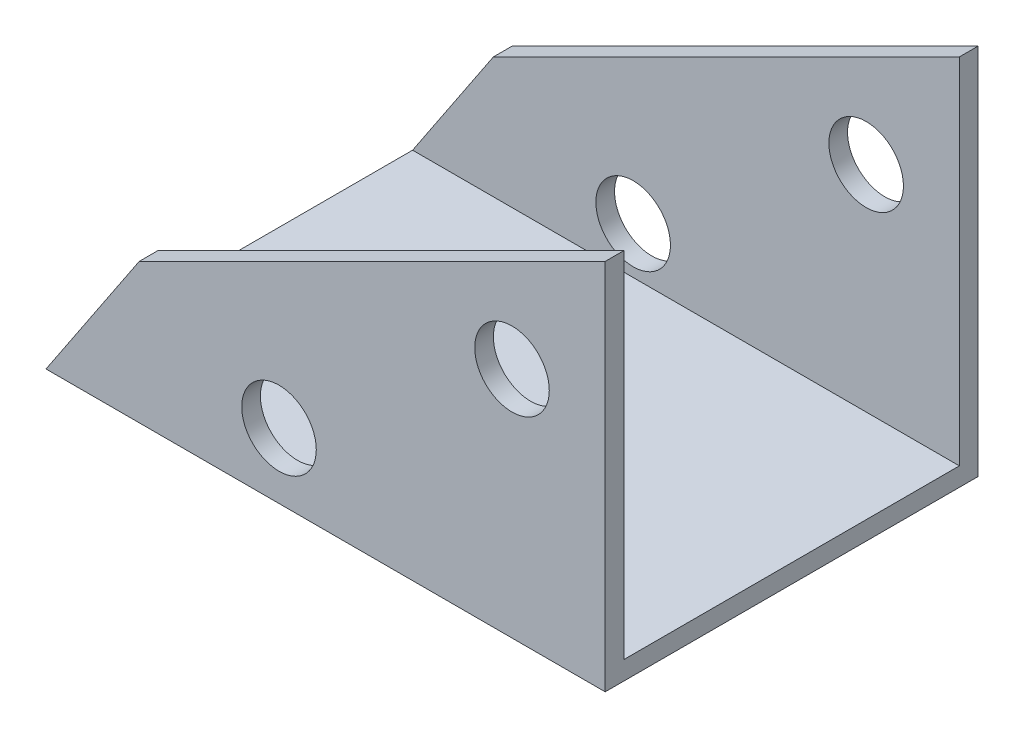
ISO-10303-21;
HEADER;
FILE_DESCRIPTION(('STEP AP214'),'2;1');
FILE_NAME('part.step','',(''),(''),'','','');
FILE_SCHEMA(('AUTOMOTIVE_DESIGN { 1 0 10303 214 1 1 1 1 }'));
ENDSEC;
DATA;
#1=APPLICATION_CONTEXT('core data for automotive mechanical design processes');
#2=APPLICATION_PROTOCOL_DEFINITION('international standard','automotive_design',2000,#1);
#3=PRODUCT_CONTEXT('',#1,'mechanical');
#4=PRODUCT('Part','Part','',(#3));
#5=PRODUCT_RELATED_PRODUCT_CATEGORY('part','',(#4));
#6=PRODUCT_DEFINITION_FORMATION('','',#4);
#7=PRODUCT_DEFINITION_CONTEXT('part definition',#1,'design');
#8=PRODUCT_DEFINITION('design','',#6,#7);
#9=PRODUCT_DEFINITION_SHAPE('','',#8);
#10=(LENGTH_UNIT() NAMED_UNIT(*) SI_UNIT(.MILLI.,.METRE.));
#11=(NAMED_UNIT(*) PLANE_ANGLE_UNIT() SI_UNIT($,.RADIAN.));
#12=(NAMED_UNIT(*) SI_UNIT($,.STERADIAN.) SOLID_ANGLE_UNIT());
#13=UNCERTAINTY_MEASURE_WITH_UNIT(LENGTH_MEASURE(1.E-05),#10,'distance_accuracy_value','');
#14=(GEOMETRIC_REPRESENTATION_CONTEXT(3) GLOBAL_UNCERTAINTY_ASSIGNED_CONTEXT((#13)) GLOBAL_UNIT_ASSIGNED_CONTEXT((#10,
#11,#12)) REPRESENTATION_CONTEXT('',''));
#15=CARTESIAN_POINT('',(0.,0.,0.));
#16=DIRECTION('',(0.,0.,1.));
#17=DIRECTION('',(1.,0.,0.));
#18=AXIS2_PLACEMENT_3D('',#15,#16,#17);
#19=CARTESIAN_POINT('',(0.,40.,0.));
#20=DIRECTION('',(0.,0.,-1.));
#21=DIRECTION('',(-1.,0.,0.));
#22=AXIS2_PLACEMENT_3D('',#19,#20,#21);
#23=PLANE('',#22);
#24=CARTESIAN_POINT('',(50.,25.,0.));
#25=DIRECTION('',(0.,0.,1.));
#26=DIRECTION('',(1.,0.,0.));
#27=AXIS2_PLACEMENT_3D('',#24,#25,#26);
#28=CIRCLE('',#27,4.00000000000001);
#29=CARTESIAN_POINT('',(54.,25.,0.));
#30=VERTEX_POINT('',#29);
#31=EDGE_CURVE('E265',#30,#30,#28,.T.);
#32=ORIENTED_EDGE('',*,*,#31,.F.);
#33=EDGE_LOOP('',(#32));
#34=FACE_BOUND('',#33,.T.);
#35=CARTESIAN_POINT('',(25.,7.,0.));
#36=DIRECTION('',(0.,0.,1.));
#37=DIRECTION('',(1.,0.,0.));
#38=AXIS2_PLACEMENT_3D('',#35,#36,#37);
#39=CIRCLE('',#38,4.);
#40=CARTESIAN_POINT('',(29.,7.,0.));
#41=VERTEX_POINT('',#40);
#42=EDGE_CURVE('E174',#41,#41,#39,.T.);
#43=ORIENTED_EDGE('',*,*,#42,.F.);
#44=EDGE_LOOP('',(#43));
#45=FACE_BOUND('',#44,.T.);
#46=DIRECTION('',(-0.554700196225229,-0.832050294337844,0.));
#47=VECTOR('',#46,1.);
#48=CARTESIAN_POINT('',(0.,0.,0.));
#49=LINE('',#48,#47);
#50=CARTESIAN_POINT('',(10.,15.,0.));
#51=VERTEX_POINT('',#50);
#52=CARTESIAN_POINT('',(0.,0.,0.));
#53=VERTEX_POINT('',#52);
#54=EDGE_CURVE('E166',#51,#53,#49,.T.);
#55=ORIENTED_EDGE('',*,*,#54,.T.);
#56=DIRECTION('',(1.,0.,0.));
#57=VECTOR('',#56,1.);
#58=CARTESIAN_POINT('',(0.,0.,0.));
#59=LINE('',#58,#57);
#60=CARTESIAN_POINT('',(60.,0.,0.));
#61=VERTEX_POINT('',#60);
#62=EDGE_CURVE('E217',#53,#61,#59,.T.);
#63=ORIENTED_EDGE('',*,*,#62,.T.);
#64=DIRECTION('',(0.,-1.,0.));
#65=VECTOR('',#64,1.);
#66=CARTESIAN_POINT('',(60.,40.,0.));
#67=LINE('',#66,#65);
#68=CARTESIAN_POINT('',(60.,40.,0.));
#69=VERTEX_POINT('',#68);
#70=EDGE_CURVE('E226',#69,#61,#67,.T.);
#71=ORIENTED_EDGE('',*,*,#70,.F.);
#72=DIRECTION('',(-0.894427190999916,-0.447213595499958,0.));
#73=VECTOR('',#72,1.);
#74=CARTESIAN_POINT('',(-4.,8.,0.));
#75=LINE('',#74,#73);
#76=EDGE_CURVE('E162',#69,#51,#75,.T.);
#77=ORIENTED_EDGE('',*,*,#76,.T.);
#78=EDGE_LOOP('',(#55,#63,#71,#77));
#79=FACE_BOUND('',#78,.T.);
#80=ADVANCED_FACE('F69',(#34,#45,#79),#23,.F.);
#81=CARTESIAN_POINT('',(0.,40.,-40.));
#82=DIRECTION('',(0.,0.,1.));
#83=DIRECTION('',(1.,0.,0.));
#84=AXIS2_PLACEMENT_3D('',#81,#82,#83);
#85=PLANE('',#84);
#86=CARTESIAN_POINT('',(50.,25.,-40.));
#87=DIRECTION('',(0.,0.,1.));
#88=DIRECTION('',(1.,0.,0.));
#89=AXIS2_PLACEMENT_3D('',#86,#87,#88);
#90=CIRCLE('',#89,4.00000000000001);
#91=CARTESIAN_POINT('',(54.,25.,-40.));
#92=VERTEX_POINT('',#91);
#93=EDGE_CURVE('E169',#92,#92,#90,.T.);
#94=ORIENTED_EDGE('',*,*,#93,.T.);
#95=EDGE_LOOP('',(#94));
#96=FACE_BOUND('',#95,.T.);
#97=CARTESIAN_POINT('',(25.,7.,-40.));
#98=DIRECTION('',(0.,0.,1.));
#99=DIRECTION('',(1.,0.,0.));
#100=AXIS2_PLACEMENT_3D('',#97,#98,#99);
#101=CIRCLE('',#100,4.);
#102=CARTESIAN_POINT('',(29.,7.,-40.));
#103=VERTEX_POINT('',#102);
#104=EDGE_CURVE('E318',#103,#103,#101,.T.);
#105=ORIENTED_EDGE('',*,*,#104,.T.);
#106=EDGE_LOOP('',(#105));
#107=FACE_BOUND('',#106,.T.);
#108=DIRECTION('',(-0.554700196225229,-0.832050294337844,0.));
#109=VECTOR('',#108,1.);
#110=CARTESIAN_POINT('',(0.,0.,-40.));
#111=LINE('',#110,#109);
#112=CARTESIAN_POINT('',(10.,15.,-40.));
#113=VERTEX_POINT('',#112);
#114=CARTESIAN_POINT('',(0.,0.,-40.));
#115=VERTEX_POINT('',#114);
#116=EDGE_CURVE('E149',#113,#115,#111,.T.);
#117=ORIENTED_EDGE('',*,*,#116,.F.);
#118=DIRECTION('',(-0.894427190999916,-0.447213595499958,0.));
#119=VECTOR('',#118,1.);
#120=CARTESIAN_POINT('',(-4.,8.,-40.));
#121=LINE('',#120,#119);
#122=CARTESIAN_POINT('',(60.,40.,-40.));
#123=VERTEX_POINT('',#122);
#124=EDGE_CURVE('E138',#123,#113,#121,.T.);
#125=ORIENTED_EDGE('',*,*,#124,.F.);
#126=DIRECTION('',(0.,-1.,0.));
#127=VECTOR('',#126,1.);
#128=CARTESIAN_POINT('',(60.,40.,-40.));
#129=LINE('',#128,#127);
#130=CARTESIAN_POINT('',(60.,0.,-40.));
#131=VERTEX_POINT('',#130);
#132=EDGE_CURVE('E214',#123,#131,#129,.T.);
#133=ORIENTED_EDGE('',*,*,#132,.T.);
#134=DIRECTION('',(-1.,0.,0.));
#135=VECTOR('',#134,1.);
#136=CARTESIAN_POINT('',(0.,0.,-40.));
#137=LINE('',#136,#135);
#138=EDGE_CURVE('E159',#131,#115,#137,.T.);
#139=ORIENTED_EDGE('',*,*,#138,.T.);
#140=EDGE_LOOP('',(#117,#125,#133,#139));
#141=FACE_BOUND('',#140,.T.);
#142=ADVANCED_FACE('F157',(#96,#107,#141),#85,.F.);
#143=CARTESIAN_POINT('',(0.,2.,-2.));
#144=DIRECTION('',(0.,0.,1.));
#145=DIRECTION('',(1.,0.,0.));
#146=AXIS2_PLACEMENT_3D('',#143,#144,#145);
#147=PLANE('',#146);
#148=CARTESIAN_POINT('',(50.,25.,-2.));
#149=DIRECTION('',(0.,0.,1.));
#150=DIRECTION('',(1.,0.,0.));
#151=AXIS2_PLACEMENT_3D('',#148,#149,#150);
#152=CIRCLE('',#151,4.00000000000001);
#153=CARTESIAN_POINT('',(54.,25.,-2.));
#154=VERTEX_POINT('',#153);
#155=EDGE_CURVE('E188',#154,#154,#152,.T.);
#156=ORIENTED_EDGE('',*,*,#155,.T.);
#157=EDGE_LOOP('',(#156));
#158=FACE_BOUND('',#157,.T.);
#159=CARTESIAN_POINT('',(25.,7.,-2.));
#160=DIRECTION('',(0.,0.,1.));
#161=DIRECTION('',(1.,0.,0.));
#162=AXIS2_PLACEMENT_3D('',#159,#160,#161);
#163=CIRCLE('',#162,4.);
#164=CARTESIAN_POINT('',(29.,7.,-2.));
#165=VERTEX_POINT('',#164);
#166=EDGE_CURVE('E184',#165,#165,#163,.T.);
#167=ORIENTED_EDGE('',*,*,#166,.T.);
#168=EDGE_LOOP('',(#167));
#169=FACE_BOUND('',#168,.T.);
#170=DIRECTION('',(-0.554700196225229,-0.832050294337844,0.));
#171=VECTOR('',#170,1.);
#172=CARTESIAN_POINT('',(0.923076923076924,1.38461538461539,-2.));
#173=LINE('',#172,#171);
#174=CARTESIAN_POINT('',(10.,15.,-2.));
#175=VERTEX_POINT('',#174);
#176=CARTESIAN_POINT('',(1.33333333333333,2.,-2.));
#177=VERTEX_POINT('',#176);
#178=EDGE_CURVE('E86',#175,#177,#173,.T.);
#179=ORIENTED_EDGE('',*,*,#178,.F.);
#180=DIRECTION('',(-0.894427190999916,-0.447213595499958,0.));
#181=VECTOR('',#180,1.);
#182=CARTESIAN_POINT('',(-3.2,8.4,-2.));
#183=LINE('',#182,#181);
#184=CARTESIAN_POINT('',(60.,40.,-2.));
#185=VERTEX_POINT('',#184);
#186=EDGE_CURVE('E180',#185,#175,#183,.T.);
#187=ORIENTED_EDGE('',*,*,#186,.F.);
#188=DIRECTION('',(0.,-1.,0.));
#189=VECTOR('',#188,1.);
#190=CARTESIAN_POINT('',(60.,2.,-2.));
#191=LINE('',#190,#189);
#192=CARTESIAN_POINT('',(60.,2.,-2.));
#193=VERTEX_POINT('',#192);
#194=EDGE_CURVE('E192',#185,#193,#191,.T.);
#195=ORIENTED_EDGE('',*,*,#194,.T.);
#196=DIRECTION('',(1.,0.,0.));
#197=VECTOR('',#196,1.);
#198=CARTESIAN_POINT('',(0.,2.,-2.));
#199=LINE('',#198,#197);
#200=EDGE_CURVE('E204',#177,#193,#199,.T.);
#201=ORIENTED_EDGE('',*,*,#200,.F.);
#202=EDGE_LOOP('',(#179,#187,#195,#201));
#203=FACE_BOUND('',#202,.T.);
#204=ADVANCED_FACE('F259',(#158,#169,#203),#147,.F.);
#205=CARTESIAN_POINT('',(0.,2.,-38.));
#206=DIRECTION('',(0.,0.,-1.));
#207=DIRECTION('',(-1.,0.,0.));
#208=AXIS2_PLACEMENT_3D('',#205,#206,#207);
#209=PLANE('',#208);
#210=CARTESIAN_POINT('',(50.,25.,-38.));
#211=DIRECTION('',(0.,0.,-1.));
#212=DIRECTION('',(-1.,0.,0.));
#213=AXIS2_PLACEMENT_3D('',#210,#211,#212);
#214=CIRCLE('',#213,4.00000000000001);
#215=CARTESIAN_POINT('',(46.,25.,-38.));
#216=VERTEX_POINT('',#215);
#217=EDGE_CURVE('E72',#216,#216,#214,.T.);
#218=ORIENTED_EDGE('',*,*,#217,.T.);
#219=EDGE_LOOP('',(#218));
#220=FACE_BOUND('',#219,.T.);
#221=CARTESIAN_POINT('',(25.,7.,-38.));
#222=DIRECTION('',(0.,0.,-1.));
#223=DIRECTION('',(-1.,0.,0.));
#224=AXIS2_PLACEMENT_3D('',#221,#222,#223);
#225=CIRCLE('',#224,4.);
#226=CARTESIAN_POINT('',(21.,7.,-38.));
#227=VERTEX_POINT('',#226);
#228=EDGE_CURVE('E183',#227,#227,#225,.T.);
#229=ORIENTED_EDGE('',*,*,#228,.T.);
#230=EDGE_LOOP('',(#229));
#231=FACE_BOUND('',#230,.T.);
#232=DIRECTION('',(0.554700196225229,0.832050294337844,0.));
#233=VECTOR('',#232,1.);
#234=CARTESIAN_POINT('',(0.923076923076924,1.38461538461539,-38.));
#235=LINE('',#234,#233);
#236=CARTESIAN_POINT('',(1.33333333333333,2.,-38.));
#237=VERTEX_POINT('',#236);
#238=CARTESIAN_POINT('',(10.,15.,-38.));
#239=VERTEX_POINT('',#238);
#240=EDGE_CURVE('E154',#237,#239,#235,.T.);
#241=ORIENTED_EDGE('',*,*,#240,.F.);
#242=DIRECTION('',(1.,0.,0.));
#243=VECTOR('',#242,1.);
#244=CARTESIAN_POINT('',(0.,2.,-38.));
#245=LINE('',#244,#243);
#246=CARTESIAN_POINT('',(60.,2.,-38.));
#247=VERTEX_POINT('',#246);
#248=EDGE_CURVE('E205',#237,#247,#245,.T.);
#249=ORIENTED_EDGE('',*,*,#248,.T.);
#250=DIRECTION('',(0.,1.,0.));
#251=VECTOR('',#250,1.);
#252=CARTESIAN_POINT('',(60.,2.,-38.));
#253=LINE('',#252,#251);
#254=CARTESIAN_POINT('',(60.,40.,-38.));
#255=VERTEX_POINT('',#254);
#256=EDGE_CURVE('E200',#247,#255,#253,.T.);
#257=ORIENTED_EDGE('',*,*,#256,.T.);
#258=DIRECTION('',(0.894427190999916,0.447213595499958,0.));
#259=VECTOR('',#258,1.);
#260=CARTESIAN_POINT('',(-3.2,8.4,-38.));
#261=LINE('',#260,#259);
#262=EDGE_CURVE('E12',#239,#255,#261,.T.);
#263=ORIENTED_EDGE('',*,*,#262,.F.);
#264=EDGE_LOOP('',(#241,#249,#257,#263));
#265=FACE_BOUND('',#264,.T.);
#266=ADVANCED_FACE('F234',(#220,#231,#265),#209,.F.);
#267=CARTESIAN_POINT('',(0.,2.,-2.));
#268=DIRECTION('',(0.,-1.,0.));
#269=DIRECTION('',(0.,0.,-1.));
#270=AXIS2_PLACEMENT_3D('',#267,#268,#269);
#271=PLANE('',#270);
#272=DIRECTION('',(0.,0.,-1.));
#273=VECTOR('',#272,1.);
#274=CARTESIAN_POINT('',(1.33333333333333,2.,-2.));
#275=LINE('',#274,#273);
#276=EDGE_CURVE('E78',#177,#237,#275,.T.);
#277=ORIENTED_EDGE('',*,*,#276,.F.);
#278=ORIENTED_EDGE('',*,*,#200,.T.);
#279=DIRECTION('',(0.,0.,-1.));
#280=VECTOR('',#279,1.);
#281=CARTESIAN_POINT('',(60.,2.,-2.));
#282=LINE('',#281,#280);
#283=EDGE_CURVE('E196',#193,#247,#282,.T.);
#284=ORIENTED_EDGE('',*,*,#283,.T.);
#285=ORIENTED_EDGE('',*,*,#248,.F.);
#286=EDGE_LOOP('',(#277,#278,#284,#285));
#287=FACE_BOUND('',#286,.T.);
#288=ADVANCED_FACE('F284',(#287),#271,.F.);
#289=CARTESIAN_POINT('',(60.,40.,0.));
#290=DIRECTION('',(-1.,0.,0.));
#291=DIRECTION('',(0.,0.,1.));
#292=AXIS2_PLACEMENT_3D('',#289,#290,#291);
#293=PLANE('',#292);
#294=ORIENTED_EDGE('',*,*,#283,.F.);
#295=ORIENTED_EDGE('',*,*,#194,.F.);
#296=DIRECTION('',(0.,0.,-1.));
#297=VECTOR('',#296,1.);
#298=CARTESIAN_POINT('',(60.,40.,0.));
#299=LINE('',#298,#297);
#300=EDGE_CURVE('E211',#69,#185,#299,.T.);
#301=ORIENTED_EDGE('',*,*,#300,.F.);
#302=ORIENTED_EDGE('',*,*,#70,.T.);
#303=DIRECTION('',(0.,0.,-1.));
#304=VECTOR('',#303,1.);
#305=CARTESIAN_POINT('',(60.,0.,0.));
#306=LINE('',#305,#304);
#307=EDGE_CURVE('E94',#61,#131,#306,.T.);
#308=ORIENTED_EDGE('',*,*,#307,.T.);
#309=ORIENTED_EDGE('',*,*,#132,.F.);
#310=EDGE_CURVE('E144',#255,#123,#299,.T.);
#311=ORIENTED_EDGE('',*,*,#310,.F.);
#312=ORIENTED_EDGE('',*,*,#256,.F.);
#313=EDGE_LOOP('',(#294,#295,#301,#302,#308,#309,#311,#312));
#314=FACE_BOUND('',#313,.T.);
#315=ADVANCED_FACE('F276',(#314),#293,.F.);
#316=CARTESIAN_POINT('',(0.,0.,0.));
#317=DIRECTION('',(0.,-1.,0.));
#318=DIRECTION('',(0.,0.,-1.));
#319=AXIS2_PLACEMENT_3D('',#316,#317,#318);
#320=PLANE('',#319);
#321=DIRECTION('',(0.,0.,1.));
#322=VECTOR('',#321,1.);
#323=CARTESIAN_POINT('',(0.,0.,0.));
#324=LINE('',#323,#322);
#325=EDGE_CURVE('E208',#115,#53,#324,.T.);
#326=ORIENTED_EDGE('',*,*,#325,.F.);
#327=ORIENTED_EDGE('',*,*,#138,.F.);
#328=ORIENTED_EDGE('',*,*,#307,.F.);
#329=ORIENTED_EDGE('',*,*,#62,.F.);
#330=EDGE_LOOP('',(#326,#327,#328,#329));
#331=FACE_BOUND('',#330,.T.);
#332=ADVANCED_FACE('F273',(#331),#320,.T.);
#333=CARTESIAN_POINT('',(-4.,8.,-40.));
#334=DIRECTION('',(-0.447213595499958,0.894427190999916,0.));
#335=DIRECTION('',(-0.894427190999916,-0.447213595499958,0.));
#336=AXIS2_PLACEMENT_3D('',#333,#334,#335);
#337=PLANE('',#336);
#338=ORIENTED_EDGE('',*,*,#186,.T.);
#339=DIRECTION('',(0.,0.,1.));
#340=VECTOR('',#339,1.);
#341=CARTESIAN_POINT('',(10.,15.,-40.));
#342=LINE('',#341,#340);
#343=EDGE_CURVE('E148',#175,#51,#342,.T.);
#344=ORIENTED_EDGE('',*,*,#343,.T.);
#345=ORIENTED_EDGE('',*,*,#76,.F.);
#346=ORIENTED_EDGE('',*,*,#300,.T.);
#347=EDGE_LOOP('',(#338,#344,#345,#346));
#348=FACE_BOUND('',#347,.T.);
#349=ADVANCED_FACE('F275',(#348),#337,.T.);
#350=ORIENTED_EDGE('',*,*,#262,.T.);
#351=ORIENTED_EDGE('',*,*,#310,.T.);
#352=ORIENTED_EDGE('',*,*,#124,.T.);
#353=EDGE_CURVE('E141',#113,#239,#342,.T.);
#354=ORIENTED_EDGE('',*,*,#353,.T.);
#355=EDGE_LOOP('',(#350,#351,#352,#354));
#356=FACE_BOUND('',#355,.T.);
#357=ADVANCED_FACE('F140',(#356),#337,.T.);
#358=CARTESIAN_POINT('',(0.,0.,-40.));
#359=DIRECTION('',(-0.832050294337844,0.554700196225229,0.));
#360=DIRECTION('',(-0.554700196225229,-0.832050294337844,0.));
#361=AXIS2_PLACEMENT_3D('',#358,#359,#360);
#362=PLANE('',#361);
#363=ORIENTED_EDGE('',*,*,#178,.T.);
#364=ORIENTED_EDGE('',*,*,#276,.T.);
#365=ORIENTED_EDGE('',*,*,#240,.T.);
#366=ORIENTED_EDGE('',*,*,#353,.F.);
#367=ORIENTED_EDGE('',*,*,#116,.T.);
#368=ORIENTED_EDGE('',*,*,#325,.T.);
#369=ORIENTED_EDGE('',*,*,#54,.F.);
#370=ORIENTED_EDGE('',*,*,#343,.F.);
#371=EDGE_LOOP('',(#363,#364,#365,#366,#367,#368,#369,#370));
#372=FACE_BOUND('',#371,.T.);
#373=ADVANCED_FACE('F151',(#372),#362,.T.);
#374=CARTESIAN_POINT('',(25.,7.,-40.));
#375=DIRECTION('',(0.,0.,1.));
#376=DIRECTION('',(1.,0.,0.));
#377=AXIS2_PLACEMENT_3D('',#374,#375,#376);
#378=CYLINDRICAL_SURFACE('',#377,4.);
#379=ORIENTED_EDGE('',*,*,#104,.F.);
#380=EDGE_LOOP('',(#379));
#381=FACE_BOUND('',#380,.T.);
#382=ORIENTED_EDGE('',*,*,#228,.F.);
#383=EDGE_LOOP('',(#382));
#384=FACE_BOUND('',#383,.T.);
#385=ADVANCED_FACE('F237',(#381,#384),#378,.F.);
#386=CARTESIAN_POINT('',(50.,25.,-40.));
#387=DIRECTION('',(0.,0.,1.));
#388=DIRECTION('',(1.,0.,0.));
#389=AXIS2_PLACEMENT_3D('',#386,#387,#388);
#390=CYLINDRICAL_SURFACE('',#389,4.00000000000001);
#391=ORIENTED_EDGE('',*,*,#93,.F.);
#392=EDGE_LOOP('',(#391));
#393=FACE_BOUND('',#392,.T.);
#394=ORIENTED_EDGE('',*,*,#217,.F.);
#395=EDGE_LOOP('',(#394));
#396=FACE_BOUND('',#395,.T.);
#397=ADVANCED_FACE('F239',(#393,#396),#390,.F.);
#398=ORIENTED_EDGE('',*,*,#42,.T.);
#399=EDGE_LOOP('',(#398));
#400=FACE_BOUND('',#399,.T.);
#401=ORIENTED_EDGE('',*,*,#166,.F.);
#402=EDGE_LOOP('',(#401));
#403=FACE_BOUND('',#402,.T.);
#404=ADVANCED_FACE('F242',(#400,#403),#378,.F.);
#405=ORIENTED_EDGE('',*,*,#31,.T.);
#406=EDGE_LOOP('',(#405));
#407=FACE_BOUND('',#406,.T.);
#408=ORIENTED_EDGE('',*,*,#155,.F.);
#409=EDGE_LOOP('',(#408));
#410=FACE_BOUND('',#409,.T.);
#411=ADVANCED_FACE('F249',(#407,#410),#390,.F.);
#412=CLOSED_SHELL('',(#80,#142,#204,#266,#288,#315,#332,#349,#357,#373,#385,#397,#404,#411));
#413=MANIFOLD_SOLID_BREP('B2',#412);
#414=ADVANCED_BREP_SHAPE_REPRESENTATION('',(#18,#413),#14);
#415=SHAPE_DEFINITION_REPRESENTATION(#9,#414);
ENDSEC;
END-ISO-10303-21;
